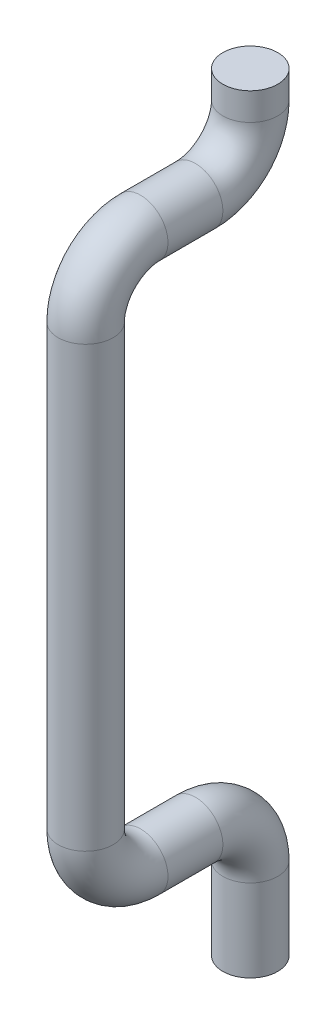
ISO-10303-21;
HEADER;
FILE_DESCRIPTION(('STEP AP214'),'2;1');
FILE_NAME('part.step','',(''),(''),'','','');
FILE_SCHEMA(('AUTOMOTIVE_DESIGN { 1 0 10303 214 1 1 1 1 }'));
ENDSEC;
DATA;
#1=APPLICATION_CONTEXT('core data for automotive mechanical design processes');
#2=APPLICATION_PROTOCOL_DEFINITION('international standard','automotive_design',2000,#1);
#3=PRODUCT_CONTEXT('',#1,'mechanical');
#4=PRODUCT('Part','Part','',(#3));
#5=PRODUCT_RELATED_PRODUCT_CATEGORY('part','',(#4));
#6=PRODUCT_DEFINITION_FORMATION('','',#4);
#7=PRODUCT_DEFINITION_CONTEXT('part definition',#1,'design');
#8=PRODUCT_DEFINITION('design','',#6,#7);
#9=PRODUCT_DEFINITION_SHAPE('','',#8);
#10=(LENGTH_UNIT() NAMED_UNIT(*) SI_UNIT(.MILLI.,.METRE.));
#11=(NAMED_UNIT(*) PLANE_ANGLE_UNIT() SI_UNIT($,.RADIAN.));
#12=(NAMED_UNIT(*) SI_UNIT($,.STERADIAN.) SOLID_ANGLE_UNIT());
#13=UNCERTAINTY_MEASURE_WITH_UNIT(LENGTH_MEASURE(1.E-05),#10,'distance_accuracy_value','');
#14=(GEOMETRIC_REPRESENTATION_CONTEXT(3) GLOBAL_UNCERTAINTY_ASSIGNED_CONTEXT((#13)) GLOBAL_UNIT_ASSIGNED_CONTEXT((#10,
#11,#12)) REPRESENTATION_CONTEXT('',''));
#15=CARTESIAN_POINT('',(0.,0.,0.));
#16=DIRECTION('',(0.,0.,1.));
#17=DIRECTION('',(1.,0.,0.));
#18=AXIS2_PLACEMENT_3D('',#15,#16,#17);
#19=CARTESIAN_POINT('',(0.,25.,-15.22));
#20=DIRECTION('',(0.,1.,0.));
#21=DIRECTION('',(0.,0.,1.));
#22=AXIS2_PLACEMENT_3D('',#19,#20,#21);
#23=CYLINDRICAL_SURFACE('',#22,1.);
#24=CARTESIAN_POINT('',(0.,25.,-15.22));
#25=DIRECTION('',(0.,1.,0.));
#26=DIRECTION('',(0.,0.,1.));
#27=AXIS2_PLACEMENT_3D('',#24,#25,#26);
#28=CIRCLE('',#27,1.);
#29=CARTESIAN_POINT('',(0.,25.,-16.22));
#30=VERTEX_POINT('',#29);
#31=EDGE_CURVE('E39',#30,#30,#28,.T.);
#32=ORIENTED_EDGE('',*,*,#31,.T.);
#33=EDGE_LOOP('',(#32));
#34=FACE_BOUND('',#33,.T.);
#35=CARTESIAN_POINT('',(0.,26.,-15.22));
#36=DIRECTION('',(0.,1.,0.));
#37=DIRECTION('',(0.,0.,1.));
#38=AXIS2_PLACEMENT_3D('',#35,#36,#37);
#39=CIRCLE('',#38,1.);
#40=CARTESIAN_POINT('',(0.,26.,-14.22));
#41=VERTEX_POINT('',#40);
#42=EDGE_CURVE('E10',#41,#41,#39,.T.);
#43=ORIENTED_EDGE('',*,*,#42,.F.);
#44=EDGE_LOOP('',(#43));
#45=FACE_BOUND('',#44,.T.);
#46=ADVANCED_FACE('F33',(#34,#45),#23,.T.);
#47=CARTESIAN_POINT('',(0.,25.,-13.22));
#48=DIRECTION('',(1.,0.,0.));
#49=DIRECTION('',(0.,0.,-1.));
#50=AXIS2_PLACEMENT_3D('',#47,#48,#49);
#51=TOROIDAL_SURFACE('',#50,2.00000000000001,1.);
#52=CARTESIAN_POINT('',(0.,23.,-13.22));
#53=DIRECTION('',(0.,0.,-1.));
#54=DIRECTION('',(0.,1.,0.));
#55=AXIS2_PLACEMENT_3D('',#52,#53,#54);
#56=CIRCLE('',#55,1.);
#57=CARTESIAN_POINT('',(0.,22.,-13.22));
#58=VERTEX_POINT('',#57);
#59=EDGE_CURVE('E43',#58,#58,#56,.T.);
#60=CARTESIAN_POINT('',(0.,25.,-13.22));
#61=DIRECTION('',(1.,0.,0.));
#62=DIRECTION('',(0.,0.,-1.));
#63=AXIS2_PLACEMENT_3D('',#60,#61,#62);
#64=CIRCLE('',#63,3.00000000000001);
#65=EDGE_CURVE('',#58,#30,#64,.T.);
#66=ORIENTED_EDGE('',*,*,#59,.T.);
#67=ORIENTED_EDGE('',*,*,#31,.F.);
#68=ORIENTED_EDGE('',*,*,#65,.T.);
#69=ORIENTED_EDGE('',*,*,#65,.F.);
#70=EDGE_LOOP('',(#66,#68,#67,#69));
#71=FACE_BOUND('',#70,.T.);
#72=ADVANCED_FACE('F89',(#71),#51,.T.);
#73=CARTESIAN_POINT('',(0.,23.,-11.22));
#74=DIRECTION('',(0.,0.,-1.));
#75=DIRECTION('',(0.,1.,0.));
#76=AXIS2_PLACEMENT_3D('',#73,#74,#75);
#77=CYLINDRICAL_SURFACE('',#76,1.);
#78=CARTESIAN_POINT('',(0.,23.,-11.22));
#79=DIRECTION('',(0.,0.,-1.));
#80=DIRECTION('',(0.,1.,0.));
#81=AXIS2_PLACEMENT_3D('',#78,#79,#80);
#82=CIRCLE('',#81,1.);
#83=CARTESIAN_POINT('',(0.,24.,-11.22));
#84=VERTEX_POINT('',#83);
#85=EDGE_CURVE('E47',#84,#84,#82,.T.);
#86=ORIENTED_EDGE('',*,*,#85,.T.);
#87=EDGE_LOOP('',(#86));
#88=FACE_BOUND('',#87,.T.);
#89=ORIENTED_EDGE('',*,*,#59,.F.);
#90=EDGE_LOOP('',(#89));
#91=FACE_BOUND('',#90,.T.);
#92=ADVANCED_FACE('F93',(#88,#91),#77,.T.);
#93=CARTESIAN_POINT('',(0.,21.,-11.22));
#94=DIRECTION('',(-1.,0.,0.));
#95=DIRECTION('',(0.,0.,1.));
#96=AXIS2_PLACEMENT_3D('',#93,#94,#95);
#97=TOROIDAL_SURFACE('',#96,2.,1.);
#98=CARTESIAN_POINT('',(0.,21.,-9.22));
#99=DIRECTION('',(0.,1.,0.));
#100=DIRECTION('',(0.,0.,1.));
#101=AXIS2_PLACEMENT_3D('',#98,#99,#100);
#102=CIRCLE('',#101,1.);
#103=CARTESIAN_POINT('',(0.,21.,-8.22));
#104=VERTEX_POINT('',#103);
#105=EDGE_CURVE('E52',#104,#104,#102,.T.);
#106=CARTESIAN_POINT('',(0.,21.,-11.22));
#107=DIRECTION('',(-1.,0.,0.));
#108=DIRECTION('',(0.,0.,1.));
#109=AXIS2_PLACEMENT_3D('',#106,#107,#108);
#110=CIRCLE('',#109,3.);
#111=EDGE_CURVE('',#104,#84,#110,.T.);
#112=ORIENTED_EDGE('',*,*,#105,.T.);
#113=ORIENTED_EDGE('',*,*,#85,.F.);
#114=ORIENTED_EDGE('',*,*,#111,.T.);
#115=ORIENTED_EDGE('',*,*,#111,.F.);
#116=EDGE_LOOP('',(#112,#114,#113,#115));
#117=FACE_BOUND('',#116,.T.);
#118=ADVANCED_FACE('F99',(#117),#97,.T.);
#119=CARTESIAN_POINT('',(0.,5.,-9.22));
#120=DIRECTION('',(0.,1.,0.));
#121=DIRECTION('',(0.,0.,1.));
#122=AXIS2_PLACEMENT_3D('',#119,#120,#121);
#123=CYLINDRICAL_SURFACE('',#122,1.);
#124=CARTESIAN_POINT('',(0.,5.,-9.22));
#125=DIRECTION('',(0.,1.,0.));
#126=DIRECTION('',(0.,0.,1.));
#127=AXIS2_PLACEMENT_3D('',#124,#125,#126);
#128=CIRCLE('',#127,1.);
#129=CARTESIAN_POINT('',(0.,5.,-8.22));
#130=VERTEX_POINT('',#129);
#131=EDGE_CURVE('E55',#130,#130,#128,.T.);
#132=ORIENTED_EDGE('',*,*,#131,.T.);
#133=EDGE_LOOP('',(#132));
#134=FACE_BOUND('',#133,.T.);
#135=ORIENTED_EDGE('',*,*,#105,.F.);
#136=EDGE_LOOP('',(#135));
#137=FACE_BOUND('',#136,.T.);
#138=ADVANCED_FACE('F106',(#134,#137),#123,.T.);
#139=CARTESIAN_POINT('',(0.,5.,-11.22));
#140=DIRECTION('',(-1.,0.,0.));
#141=DIRECTION('',(0.,0.,1.));
#142=AXIS2_PLACEMENT_3D('',#139,#140,#141);
#143=TOROIDAL_SURFACE('',#142,2.,1.);
#144=CARTESIAN_POINT('',(0.,3.,-11.22));
#145=DIRECTION('',(0.,0.,1.));
#146=DIRECTION('',(0.,-1.,0.));
#147=AXIS2_PLACEMENT_3D('',#144,#145,#146);
#148=CIRCLE('',#147,1.);
#149=CARTESIAN_POINT('',(0.,2.,-11.22));
#150=VERTEX_POINT('',#149);
#151=EDGE_CURVE('E58',#150,#150,#148,.T.);
#152=CARTESIAN_POINT('',(0.,5.,-11.22));
#153=DIRECTION('',(-1.,0.,0.));
#154=DIRECTION('',(0.,0.,1.));
#155=AXIS2_PLACEMENT_3D('',#152,#153,#154);
#156=CIRCLE('',#155,3.);
#157=EDGE_CURVE('',#150,#130,#156,.T.);
#158=ORIENTED_EDGE('',*,*,#151,.T.);
#159=ORIENTED_EDGE('',*,*,#131,.F.);
#160=ORIENTED_EDGE('',*,*,#157,.T.);
#161=ORIENTED_EDGE('',*,*,#157,.F.);
#162=EDGE_LOOP('',(#158,#160,#159,#161));
#163=FACE_BOUND('',#162,.T.);
#164=ADVANCED_FACE('F110',(#163),#143,.T.);
#165=CARTESIAN_POINT('',(0.,3.,-13.22));
#166=DIRECTION('',(0.,0.,1.));
#167=DIRECTION('',(1.,0.,0.));
#168=AXIS2_PLACEMENT_3D('',#165,#166,#167);
#169=CYLINDRICAL_SURFACE('',#168,1.);
#170=CARTESIAN_POINT('',(0.,3.,-13.22));
#171=DIRECTION('',(0.,0.,1.));
#172=DIRECTION('',(0.,-1.,0.));
#173=AXIS2_PLACEMENT_3D('',#170,#171,#172);
#174=CIRCLE('',#173,1.);
#175=CARTESIAN_POINT('',(0.,4.,-13.22));
#176=VERTEX_POINT('',#175);
#177=EDGE_CURVE('E61',#176,#176,#174,.T.);
#178=ORIENTED_EDGE('',*,*,#177,.T.);
#179=EDGE_LOOP('',(#178));
#180=FACE_BOUND('',#179,.T.);
#181=ORIENTED_EDGE('',*,*,#151,.F.);
#182=EDGE_LOOP('',(#181));
#183=FACE_BOUND('',#182,.T.);
#184=ADVANCED_FACE('F114',(#180,#183),#169,.T.);
#185=CARTESIAN_POINT('',(0.,1.,-13.22));
#186=DIRECTION('',(1.,0.,0.));
#187=DIRECTION('',(0.,0.,-1.));
#188=AXIS2_PLACEMENT_3D('',#185,#186,#187);
#189=TOROIDAL_SURFACE('',#188,2.,1.);
#190=CARTESIAN_POINT('',(0.,1.,-15.22));
#191=DIRECTION('',(0.,1.,0.));
#192=DIRECTION('',(0.,0.,1.));
#193=AXIS2_PLACEMENT_3D('',#190,#191,#192);
#194=CIRCLE('',#193,1.);
#195=CARTESIAN_POINT('',(0.,1.,-16.22));
#196=VERTEX_POINT('',#195);
#197=EDGE_CURVE('E64',#196,#196,#194,.T.);
#198=CARTESIAN_POINT('',(0.,1.,-13.22));
#199=DIRECTION('',(1.,0.,0.));
#200=DIRECTION('',(0.,0.,-1.));
#201=AXIS2_PLACEMENT_3D('',#198,#199,#200);
#202=CIRCLE('',#201,3.);
#203=EDGE_CURVE('',#196,#176,#202,.T.);
#204=ORIENTED_EDGE('',*,*,#197,.T.);
#205=ORIENTED_EDGE('',*,*,#177,.F.);
#206=ORIENTED_EDGE('',*,*,#203,.T.);
#207=ORIENTED_EDGE('',*,*,#203,.F.);
#208=EDGE_LOOP('',(#204,#206,#205,#207));
#209=FACE_BOUND('',#208,.T.);
#210=ADVANCED_FACE('F71',(#209),#189,.T.);
#211=CARTESIAN_POINT('',(0.,1.,-15.22));
#212=DIRECTION('',(0.,-1.,0.));
#213=DIRECTION('',(0.,0.,-1.));
#214=AXIS2_PLACEMENT_3D('',#211,#212,#213);
#215=CYLINDRICAL_SURFACE('',#214,1.);
#216=ORIENTED_EDGE('',*,*,#197,.F.);
#217=EDGE_LOOP('',(#216));
#218=FACE_BOUND('',#217,.T.);
#219=CARTESIAN_POINT('',(0.,-2.,-15.22));
#220=DIRECTION('',(0.,1.,0.));
#221=DIRECTION('',(0.,0.,1.));
#222=AXIS2_PLACEMENT_3D('',#219,#220,#221);
#223=CIRCLE('',#222,1.);
#224=CARTESIAN_POINT('',(0.,-2.,-14.22));
#225=VERTEX_POINT('',#224);
#226=EDGE_CURVE('E65',#225,#225,#223,.T.);
#227=ORIENTED_EDGE('',*,*,#226,.T.);
#228=EDGE_LOOP('',(#227));
#229=FACE_BOUND('',#228,.T.);
#230=ADVANCED_FACE('F74',(#218,#229),#215,.T.);
#231=CARTESIAN_POINT('',(0.,26.,-15.22));
#232=DIRECTION('',(0.,1.,0.));
#233=DIRECTION('',(0.,0.,1.));
#234=AXIS2_PLACEMENT_3D('',#231,#232,#233);
#235=PLANE('',#234);
#236=ORIENTED_EDGE('',*,*,#42,.T.);
#237=EDGE_LOOP('',(#236));
#238=FACE_BOUND('',#237,.T.);
#239=ADVANCED_FACE('F77',(#238),#235,.T.);
#240=CARTESIAN_POINT('',(0.,-2.,-15.22));
#241=DIRECTION('',(0.,1.,0.));
#242=DIRECTION('',(0.,0.,1.));
#243=AXIS2_PLACEMENT_3D('',#240,#241,#242);
#244=PLANE('',#243);
#245=ORIENTED_EDGE('',*,*,#226,.F.);
#246=EDGE_LOOP('',(#245));
#247=FACE_BOUND('',#246,.T.);
#248=ADVANCED_FACE('F81',(#247),#244,.F.);
#249=CLOSED_SHELL('',(#46,#72,#92,#118,#138,#164,#184,#210,#230,#239,#248));
#250=MANIFOLD_SOLID_BREP('B2',#249);
#251=ADVANCED_BREP_SHAPE_REPRESENTATION('',(#18,#250),#14);
#252=SHAPE_DEFINITION_REPRESENTATION(#9,#251);
ENDSEC;
END-ISO-10303-21;
